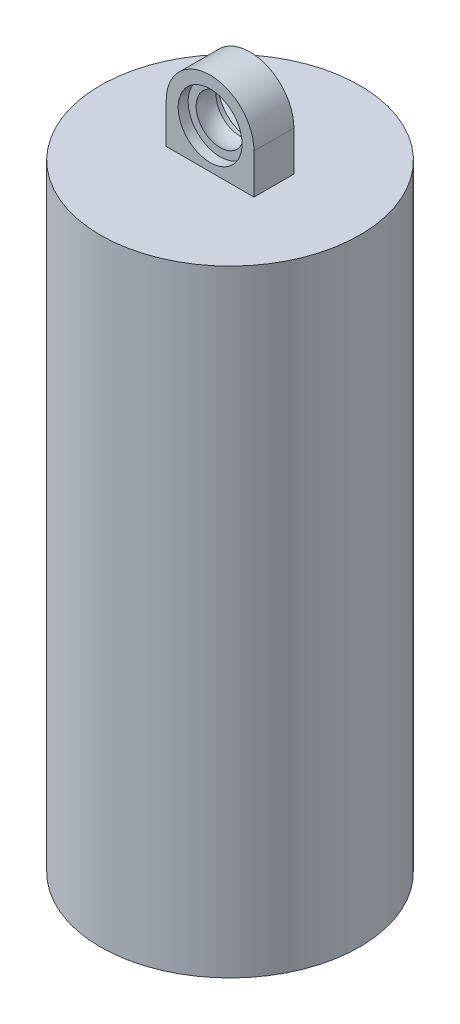
ISO-10303-21;
HEADER;
FILE_DESCRIPTION(('STEP AP214'),'2;1');
FILE_NAME('part.step','',(''),(''),'','','');
FILE_SCHEMA(('AUTOMOTIVE_DESIGN { 1 0 10303 214 1 1 1 1 }'));
ENDSEC;
DATA;
#1=APPLICATION_CONTEXT('core data for automotive mechanical design processes');
#2=APPLICATION_PROTOCOL_DEFINITION('international standard','automotive_design',2000,#1);
#3=PRODUCT_CONTEXT('',#1,'mechanical');
#4=PRODUCT('Part','Part','',(#3));
#5=PRODUCT_RELATED_PRODUCT_CATEGORY('part','',(#4));
#6=PRODUCT_DEFINITION_FORMATION('','',#4);
#7=PRODUCT_DEFINITION_CONTEXT('part definition',#1,'design');
#8=PRODUCT_DEFINITION('design','',#6,#7);
#9=PRODUCT_DEFINITION_SHAPE('','',#8);
#10=(LENGTH_UNIT() NAMED_UNIT(*) SI_UNIT(.MILLI.,.METRE.));
#11=(NAMED_UNIT(*) PLANE_ANGLE_UNIT() SI_UNIT($,.RADIAN.));
#12=(NAMED_UNIT(*) SI_UNIT($,.STERADIAN.) SOLID_ANGLE_UNIT());
#13=UNCERTAINTY_MEASURE_WITH_UNIT(LENGTH_MEASURE(1.E-05),#10,'distance_accuracy_value','');
#14=(GEOMETRIC_REPRESENTATION_CONTEXT(3) GLOBAL_UNCERTAINTY_ASSIGNED_CONTEXT((#13)) GLOBAL_UNIT_ASSIGNED_CONTEXT((#10,
#11,#12)) REPRESENTATION_CONTEXT('',''));
#15=CARTESIAN_POINT('',(0.,0.,0.));
#16=DIRECTION('',(0.,0.,1.));
#17=DIRECTION('',(1.,0.,0.));
#18=AXIS2_PLACEMENT_3D('',#15,#16,#17);
#19=CARTESIAN_POINT('',(0.,164.5,-5.));
#20=DIRECTION('',(0.,0.,1.));
#21=DIRECTION('',(1.,0.,0.));
#22=AXIS2_PLACEMENT_3D('',#19,#20,#21);
#23=CYLINDRICAL_SURFACE('',#22,8.00000000000001);
#24=CARTESIAN_POINT('',(0.,164.5,-5.));
#25=DIRECTION('',(0.,0.,1.));
#26=DIRECTION('',(1.,0.,0.));
#27=AXIS2_PLACEMENT_3D('',#24,#25,#26);
#28=CIRCLE('',#27,8.00000000000001);
#29=CARTESIAN_POINT('',(8.00000000000001,164.5,-5.));
#30=VERTEX_POINT('',#29);
#31=EDGE_CURVE('E121',#30,#30,#28,.T.);
#32=ORIENTED_EDGE('',*,*,#31,.F.);
#33=EDGE_LOOP('',(#32));
#34=FACE_BOUND('',#33,.T.);
#35=CARTESIAN_POINT('',(0.,164.5,-2.5));
#36=DIRECTION('',(0.,0.,1.));
#37=DIRECTION('',(1.,0.,0.));
#38=AXIS2_PLACEMENT_3D('',#35,#36,#37);
#39=CIRCLE('',#38,8.00000000000001);
#40=CARTESIAN_POINT('',(8.00000000000001,164.5,-2.5));
#41=VERTEX_POINT('',#40);
#42=EDGE_CURVE('E12',#41,#41,#39,.F.);
#43=ORIENTED_EDGE('',*,*,#42,.F.);
#44=EDGE_LOOP('',(#43));
#45=FACE_BOUND('',#44,.T.);
#46=ADVANCED_FACE('F46',(#34,#45),#23,.F.);
#47=CARTESIAN_POINT('',(0.,154.5,0.));
#48=DIRECTION('',(0.,-1.,0.));
#49=DIRECTION('',(0.,0.,-1.));
#50=AXIS2_PLACEMENT_3D('',#47,#48,#49);
#51=CYLINDRICAL_SURFACE('',#50,32.5);
#52=CARTESIAN_POINT('',(0.,154.5,0.));
#53=DIRECTION('',(0.,1.,0.));
#54=DIRECTION('',(0.,0.,1.));
#55=AXIS2_PLACEMENT_3D('',#52,#53,#54);
#56=CIRCLE('',#55,32.5);
#57=CARTESIAN_POINT('',(0.,154.5,32.5));
#58=VERTEX_POINT('',#57);
#59=EDGE_CURVE('E141',#58,#58,#56,.T.);
#60=ORIENTED_EDGE('',*,*,#59,.F.);
#61=EDGE_LOOP('',(#60));
#62=FACE_BOUND('',#61,.T.);
#63=CARTESIAN_POINT('',(0.,0.,0.));
#64=DIRECTION('',(0.,1.,0.));
#65=DIRECTION('',(0.,0.,1.));
#66=AXIS2_PLACEMENT_3D('',#63,#64,#65);
#67=CIRCLE('',#66,32.5);
#68=CARTESIAN_POINT('',(0.,0.,32.5));
#69=VERTEX_POINT('',#68);
#70=EDGE_CURVE('E138',#69,#69,#67,.T.);
#71=ORIENTED_EDGE('',*,*,#70,.T.);
#72=EDGE_LOOP('',(#71));
#73=FACE_BOUND('',#72,.T.);
#74=ADVANCED_FACE('F48',(#62,#73),#51,.T.);
#75=CARTESIAN_POINT('',(0.,154.5,0.));
#76=DIRECTION('',(0.,1.,0.));
#77=DIRECTION('',(0.,0.,1.));
#78=AXIS2_PLACEMENT_3D('',#75,#76,#77);
#79=PLANE('',#78);
#80=DIRECTION('',(1.,0.,0.));
#81=VECTOR('',#80,1.);
#82=CARTESIAN_POINT('',(-11.,154.5,5.));
#83=LINE('',#82,#81);
#84=CARTESIAN_POINT('',(-11.,154.5,5.));
#85=VERTEX_POINT('',#84);
#86=CARTESIAN_POINT('',(11.,154.5,5.));
#87=VERTEX_POINT('',#86);
#88=EDGE_CURVE('E61',#85,#87,#83,.T.);
#89=ORIENTED_EDGE('',*,*,#88,.F.);
#90=DIRECTION('',(0.,0.,1.));
#91=VECTOR('',#90,1.);
#92=CARTESIAN_POINT('',(-11.,154.5,-5.));
#93=LINE('',#92,#91);
#94=CARTESIAN_POINT('',(-11.,154.5,-5.));
#95=VERTEX_POINT('',#94);
#96=EDGE_CURVE('E104',#95,#85,#93,.T.);
#97=ORIENTED_EDGE('',*,*,#96,.F.);
#98=DIRECTION('',(1.,0.,0.));
#99=VECTOR('',#98,1.);
#100=CARTESIAN_POINT('',(-11.,154.5,-5.));
#101=LINE('',#100,#99);
#102=CARTESIAN_POINT('',(11.,154.5,-5.));
#103=VERTEX_POINT('',#102);
#104=EDGE_CURVE('E92',#95,#103,#101,.T.);
#105=ORIENTED_EDGE('',*,*,#104,.T.);
#106=DIRECTION('',(0.,0.,1.));
#107=VECTOR('',#106,1.);
#108=CARTESIAN_POINT('',(11.,154.5,-5.));
#109=LINE('',#108,#107);
#110=EDGE_CURVE('E97',#103,#87,#109,.T.);
#111=ORIENTED_EDGE('',*,*,#110,.T.);
#112=EDGE_LOOP('',(#89,#97,#105,#111));
#113=FACE_BOUND('',#112,.T.);
#114=ORIENTED_EDGE('',*,*,#59,.T.);
#115=EDGE_LOOP('',(#114));
#116=FACE_BOUND('',#115,.T.);
#117=ADVANCED_FACE('F110',(#113,#116),#79,.T.);
#118=CARTESIAN_POINT('',(0.,0.,0.));
#119=DIRECTION('',(0.,1.,0.));
#120=DIRECTION('',(0.,0.,1.));
#121=AXIS2_PLACEMENT_3D('',#118,#119,#120);
#122=PLANE('',#121);
#123=CARTESIAN_POINT('',(0.,0.,0.));
#124=DIRECTION('',(0.,-1.,0.));
#125=DIRECTION('',(0.,0.,-1.));
#126=AXIS2_PLACEMENT_3D('',#123,#124,#125);
#127=CIRCLE('',#126,12.5);
#128=CARTESIAN_POINT('',(0.,0.,-12.5));
#129=VERTEX_POINT('',#128);
#130=EDGE_CURVE('E54',#129,#129,#127,.T.);
#131=ORIENTED_EDGE('',*,*,#130,.F.);
#132=EDGE_LOOP('',(#131));
#133=FACE_BOUND('',#132,.T.);
#134=ORIENTED_EDGE('',*,*,#70,.F.);
#135=EDGE_LOOP('',(#134));
#136=FACE_BOUND('',#135,.T.);
#137=ADVANCED_FACE('F147',(#133,#136),#122,.F.);
#138=CARTESIAN_POINT('',(0.,-6.,0.));
#139=DIRECTION('',(0.,1.,0.));
#140=DIRECTION('',(0.,0.,1.));
#141=AXIS2_PLACEMENT_3D('',#138,#139,#140);
#142=CYLINDRICAL_SURFACE('',#141,12.5);
#143=CARTESIAN_POINT('',(0.,-6.,0.));
#144=DIRECTION('',(0.,-1.,0.));
#145=DIRECTION('',(0.,0.,-1.));
#146=AXIS2_PLACEMENT_3D('',#143,#144,#145);
#147=CIRCLE('',#146,12.5);
#148=CARTESIAN_POINT('',(0.,-6.,-12.5));
#149=VERTEX_POINT('',#148);
#150=EDGE_CURVE('E133',#149,#149,#147,.T.);
#151=ORIENTED_EDGE('',*,*,#150,.F.);
#152=EDGE_LOOP('',(#151));
#153=FACE_BOUND('',#152,.T.);
#154=ORIENTED_EDGE('',*,*,#130,.T.);
#155=EDGE_LOOP('',(#154));
#156=FACE_BOUND('',#155,.T.);
#157=ADVANCED_FACE('F149',(#153,#156),#142,.T.);
#158=CARTESIAN_POINT('',(0.,-6.,0.));
#159=DIRECTION('',(0.,-1.,0.));
#160=DIRECTION('',(0.,0.,-1.));
#161=AXIS2_PLACEMENT_3D('',#158,#159,#160);
#162=PLANE('',#161);
#163=CARTESIAN_POINT('',(0.,-6.,0.));
#164=DIRECTION('',(0.,-1.,0.));
#165=DIRECTION('',(0.,0.,-1.));
#166=AXIS2_PLACEMENT_3D('',#163,#164,#165);
#167=CIRCLE('',#166,6.);
#168=CARTESIAN_POINT('',(0.,-6.,-6.));
#169=VERTEX_POINT('',#168);
#170=EDGE_CURVE('E127',#169,#169,#167,.T.);
#171=ORIENTED_EDGE('',*,*,#170,.F.);
#172=EDGE_LOOP('',(#171));
#173=FACE_BOUND('',#172,.T.);
#174=ORIENTED_EDGE('',*,*,#150,.T.);
#175=EDGE_LOOP('',(#174));
#176=FACE_BOUND('',#175,.T.);
#177=ADVANCED_FACE('F155',(#173,#176),#162,.T.);
#178=CARTESIAN_POINT('',(0.,74.,0.));
#179=DIRECTION('',(0.,-1.,0.));
#180=DIRECTION('',(0.,0.,-1.));
#181=AXIS2_PLACEMENT_3D('',#178,#179,#180);
#182=CYLINDRICAL_SURFACE('',#181,6.);
#183=CARTESIAN_POINT('',(0.,74.,0.));
#184=DIRECTION('',(0.,-1.,0.));
#185=DIRECTION('',(0.,0.,-1.));
#186=AXIS2_PLACEMENT_3D('',#183,#184,#185);
#187=CIRCLE('',#186,6.);
#188=CARTESIAN_POINT('',(0.,74.,-6.));
#189=VERTEX_POINT('',#188);
#190=EDGE_CURVE('E130',#189,#189,#187,.T.);
#191=ORIENTED_EDGE('',*,*,#190,.F.);
#192=EDGE_LOOP('',(#191));
#193=FACE_BOUND('',#192,.T.);
#194=ORIENTED_EDGE('',*,*,#170,.T.);
#195=EDGE_LOOP('',(#194));
#196=FACE_BOUND('',#195,.T.);
#197=ADVANCED_FACE('F282',(#193,#196),#182,.F.);
#198=CARTESIAN_POINT('',(0.,74.,0.));
#199=DIRECTION('',(0.,-1.,0.));
#200=DIRECTION('',(0.,0.,-1.));
#201=AXIS2_PLACEMENT_3D('',#198,#199,#200);
#202=PLANE('',#201);
#203=ORIENTED_EDGE('',*,*,#190,.T.);
#204=EDGE_LOOP('',(#203));
#205=FACE_BOUND('',#204,.T.);
#206=ADVANCED_FACE('F273',(#205),#202,.T.);
#207=CARTESIAN_POINT('',(-11.,154.5,-5.));
#208=DIRECTION('',(-1.,0.,0.));
#209=DIRECTION('',(0.,-1.,0.));
#210=AXIS2_PLACEMENT_3D('',#207,#208,#209);
#211=PLANE('',#210);
#212=DIRECTION('',(0.,-1.,0.));
#213=VECTOR('',#212,1.);
#214=CARTESIAN_POINT('',(-11.,154.5,5.));
#215=LINE('',#214,#213);
#216=CARTESIAN_POINT('',(-11.,164.5,5.));
#217=VERTEX_POINT('',#216);
#218=EDGE_CURVE('E119',#217,#85,#215,.T.);
#219=ORIENTED_EDGE('',*,*,#218,.F.);
#220=DIRECTION('',(0.,0.,1.));
#221=VECTOR('',#220,1.);
#222=CARTESIAN_POINT('',(-11.,164.5,-5.));
#223=LINE('',#222,#221);
#224=CARTESIAN_POINT('',(-11.,164.5,-5.));
#225=VERTEX_POINT('',#224);
#226=EDGE_CURVE('E70',#225,#217,#223,.T.);
#227=ORIENTED_EDGE('',*,*,#226,.F.);
#228=DIRECTION('',(0.,-1.,0.));
#229=VECTOR('',#228,1.);
#230=CARTESIAN_POINT('',(-11.,154.5,-5.));
#231=LINE('',#230,#229);
#232=EDGE_CURVE('E112',#225,#95,#231,.T.);
#233=ORIENTED_EDGE('',*,*,#232,.T.);
#234=ORIENTED_EDGE('',*,*,#96,.T.);
#235=EDGE_LOOP('',(#219,#227,#233,#234));
#236=FACE_BOUND('',#235,.T.);
#237=ADVANCED_FACE('F265',(#236),#211,.T.);
#238=CARTESIAN_POINT('',(0.,164.5,-5.));
#239=DIRECTION('',(0.,0.,1.));
#240=DIRECTION('',(1.,0.,0.));
#241=AXIS2_PLACEMENT_3D('',#238,#239,#240);
#242=CYLINDRICAL_SURFACE('',#241,11.);
#243=CARTESIAN_POINT('',(0.,164.5,5.));
#244=DIRECTION('',(0.,0.,1.));
#245=DIRECTION('',(-1.,0.,0.));
#246=AXIS2_PLACEMENT_3D('',#243,#244,#245);
#247=CIRCLE('',#246,11.);
#248=CARTESIAN_POINT('',(11.,164.5,5.));
#249=VERTEX_POINT('',#248);
#250=EDGE_CURVE('E114',#249,#217,#247,.T.);
#251=ORIENTED_EDGE('',*,*,#250,.F.);
#252=DIRECTION('',(0.,0.,1.));
#253=VECTOR('',#252,1.);
#254=CARTESIAN_POINT('',(11.,164.5,-5.));
#255=LINE('',#254,#253);
#256=CARTESIAN_POINT('',(11.,164.5,-5.));
#257=VERTEX_POINT('',#256);
#258=EDGE_CURVE('E103',#257,#249,#255,.T.);
#259=ORIENTED_EDGE('',*,*,#258,.F.);
#260=CARTESIAN_POINT('',(0.,164.5,-5.));
#261=DIRECTION('',(0.,0.,1.));
#262=DIRECTION('',(-1.,0.,0.));
#263=AXIS2_PLACEMENT_3D('',#260,#261,#262);
#264=CIRCLE('',#263,11.);
#265=EDGE_CURVE('E107',#257,#225,#264,.T.);
#266=ORIENTED_EDGE('',*,*,#265,.T.);
#267=ORIENTED_EDGE('',*,*,#226,.T.);
#268=EDGE_LOOP('',(#251,#259,#266,#267));
#269=FACE_BOUND('',#268,.T.);
#270=ADVANCED_FACE('F257',(#269),#242,.T.);
#271=CARTESIAN_POINT('',(11.,154.5,-5.));
#272=DIRECTION('',(1.,0.,0.));
#273=DIRECTION('',(0.,1.,0.));
#274=AXIS2_PLACEMENT_3D('',#271,#272,#273);
#275=PLANE('',#274);
#276=DIRECTION('',(0.,1.,0.));
#277=VECTOR('',#276,1.);
#278=CARTESIAN_POINT('',(11.,154.5,5.));
#279=LINE('',#278,#277);
#280=EDGE_CURVE('E101',#87,#249,#279,.T.);
#281=ORIENTED_EDGE('',*,*,#280,.F.);
#282=ORIENTED_EDGE('',*,*,#110,.F.);
#283=DIRECTION('',(0.,1.,0.));
#284=VECTOR('',#283,1.);
#285=CARTESIAN_POINT('',(11.,154.5,-5.));
#286=LINE('',#285,#284);
#287=EDGE_CURVE('E99',#103,#257,#286,.T.);
#288=ORIENTED_EDGE('',*,*,#287,.T.);
#289=ORIENTED_EDGE('',*,*,#258,.T.);
#290=EDGE_LOOP('',(#281,#282,#288,#289));
#291=FACE_BOUND('',#290,.T.);
#292=ADVANCED_FACE('F98',(#291),#275,.T.);
#293=CARTESIAN_POINT('',(0.,164.5,-5.));
#294=DIRECTION('',(0.,0.,-1.));
#295=DIRECTION('',(-1.,0.,0.));
#296=AXIS2_PLACEMENT_3D('',#293,#294,#295);
#297=PLANE('',#296);
#298=ORIENTED_EDGE('',*,*,#31,.T.);
#299=EDGE_LOOP('',(#298));
#300=FACE_BOUND('',#299,.T.);
#301=ORIENTED_EDGE('',*,*,#232,.F.);
#302=ORIENTED_EDGE('',*,*,#265,.F.);
#303=ORIENTED_EDGE('',*,*,#287,.F.);
#304=ORIENTED_EDGE('',*,*,#104,.F.);
#305=EDGE_LOOP('',(#301,#302,#303,#304));
#306=FACE_BOUND('',#305,.T.);
#307=ADVANCED_FACE('F106',(#300,#306),#297,.T.);
#308=CARTESIAN_POINT('',(0.,164.5,5.));
#309=DIRECTION('',(0.,0.,-1.));
#310=DIRECTION('',(-1.,0.,0.));
#311=AXIS2_PLACEMENT_3D('',#308,#309,#310);
#312=PLANE('',#311);
#313=CARTESIAN_POINT('',(0.,164.5,5.));
#314=DIRECTION('',(0.,0.,1.));
#315=DIRECTION('',(1.,0.,0.));
#316=AXIS2_PLACEMENT_3D('',#313,#314,#315);
#317=CIRCLE('',#316,8.00000000000001);
#318=CARTESIAN_POINT('',(8.00000000000001,164.5,5.));
#319=VERTEX_POINT('',#318);
#320=EDGE_CURVE('E190',#319,#319,#317,.T.);
#321=ORIENTED_EDGE('',*,*,#320,.F.);
#322=EDGE_LOOP('',(#321));
#323=FACE_BOUND('',#322,.T.);
#324=ORIENTED_EDGE('',*,*,#218,.T.);
#325=ORIENTED_EDGE('',*,*,#88,.T.);
#326=ORIENTED_EDGE('',*,*,#280,.T.);
#327=ORIENTED_EDGE('',*,*,#250,.T.);
#328=EDGE_LOOP('',(#324,#325,#326,#327));
#329=FACE_BOUND('',#328,.T.);
#330=ADVANCED_FACE('F174',(#323,#329),#312,.F.);
#331=CARTESIAN_POINT('',(0.,164.5,2.5));
#332=DIRECTION('',(0.,0.,1.));
#333=DIRECTION('',(1.,0.,0.));
#334=AXIS2_PLACEMENT_3D('',#331,#332,#333);
#335=CIRCLE('',#334,8.);
#336=CARTESIAN_POINT('',(8.00000000000001,164.5,2.5));
#337=VERTEX_POINT('',#336);
#338=EDGE_CURVE('E187',#337,#337,#335,.T.);
#339=ORIENTED_EDGE('',*,*,#338,.F.);
#340=EDGE_LOOP('',(#339));
#341=FACE_BOUND('',#340,.T.);
#342=ORIENTED_EDGE('',*,*,#320,.T.);
#343=EDGE_LOOP('',(#342));
#344=FACE_BOUND('',#343,.T.);
#345=ADVANCED_FACE('F163',(#341,#344),#23,.F.);
#346=CARTESIAN_POINT('',(0.,164.5,-2.5));
#347=DIRECTION('',(0.,0.,1.));
#348=DIRECTION('',(1.,0.,0.));
#349=AXIS2_PLACEMENT_3D('',#346,#347,#348);
#350=PLANE('',#349);
#351=CARTESIAN_POINT('',(0.,164.5,-2.5));
#352=DIRECTION('',(0.,0.,1.));
#353=DIRECTION('',(1.,0.,0.));
#354=AXIS2_PLACEMENT_3D('',#351,#352,#353);
#355=CIRCLE('',#354,6.00000000000001);
#356=CARTESIAN_POINT('',(6.00000000000001,164.5,-2.5));
#357=VERTEX_POINT('',#356);
#358=EDGE_CURVE('E198',#357,#357,#355,.F.);
#359=ORIENTED_EDGE('',*,*,#358,.F.);
#360=EDGE_LOOP('',(#359));
#361=FACE_BOUND('',#360,.T.);
#362=ORIENTED_EDGE('',*,*,#42,.T.);
#363=EDGE_LOOP('',(#362));
#364=FACE_BOUND('',#363,.T.);
#365=ADVANCED_FACE('F173',(#361,#364),#350,.F.);
#366=CARTESIAN_POINT('',(0.,164.5,2.5));
#367=DIRECTION('',(0.,0.,1.));
#368=DIRECTION('',(1.,0.,0.));
#369=AXIS2_PLACEMENT_3D('',#366,#367,#368);
#370=PLANE('',#369);
#371=CARTESIAN_POINT('',(0.,164.5,2.5));
#372=DIRECTION('',(0.,0.,-1.));
#373=DIRECTION('',(-1.,0.,0.));
#374=AXIS2_PLACEMENT_3D('',#371,#372,#373);
#375=CIRCLE('',#374,6.00000000000001);
#376=CARTESIAN_POINT('',(-6.,164.5,2.5));
#377=VERTEX_POINT('',#376);
#378=EDGE_CURVE('E193',#377,#377,#375,.F.);
#379=ORIENTED_EDGE('',*,*,#378,.F.);
#380=EDGE_LOOP('',(#379));
#381=FACE_BOUND('',#380,.T.);
#382=ORIENTED_EDGE('',*,*,#338,.T.);
#383=EDGE_LOOP('',(#382));
#384=FACE_BOUND('',#383,.T.);
#385=ADVANCED_FACE('F180',(#381,#384),#370,.T.);
#386=CARTESIAN_POINT('',(0.,164.5,0.));
#387=DIRECTION('',(0.,1.,0.));
#388=DIRECTION('',(-1.,0.,0.));
#389=AXIS2_PLACEMENT_3D('',#386,#387,#388);
#390=SPHERICAL_SURFACE('',#389,6.50000000000001);
#391=CARTESIAN_POINT('',(0.,164.5,0.));
#392=DIRECTION('',(0.,0.,1.));
#393=DIRECTION('',(1.,0.,0.));
#394=AXIS2_PLACEMENT_3D('',#391,#392,#393);
#395=SPHERICAL_SURFACE('',#394,6.50000000000001);
#396=ORIENTED_EDGE('',*,*,#358,.T.);
#397=EDGE_LOOP('',(#396));
#398=FACE_BOUND('',#397,.T.);
#399=ORIENTED_EDGE('',*,*,#378,.T.);
#400=EDGE_LOOP('',(#399));
#401=FACE_BOUND('',#400,.T.);
#402=ADVANCED_FACE('F202',(#398,#401),#395,.F.);
#403=CLOSED_SHELL('',(#46,#74,#117,#137,#157,#177,#197,#206,#237,#270,#292,#307,#330,#345,#365,
#385,#402));
#404=MANIFOLD_SOLID_BREP('B2',#403);
#405=ADVANCED_BREP_SHAPE_REPRESENTATION('',(#18,#404),#14);
#406=SHAPE_DEFINITION_REPRESENTATION(#9,#405);
ENDSEC;
END-ISO-10303-21;
